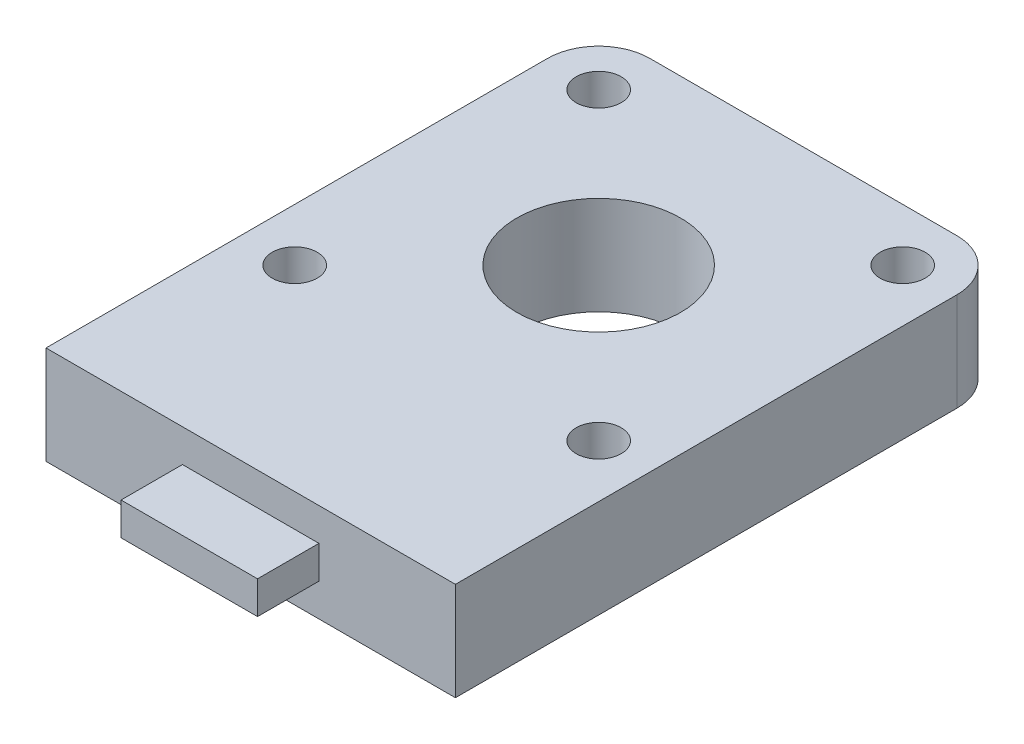
ISO-10303-21;
HEADER;
FILE_DESCRIPTION(('STEP AP214'),'2;1');
FILE_NAME('part.step','',(''),(''),'','','');
FILE_SCHEMA(('AUTOMOTIVE_DESIGN { 1 0 10303 214 1 1 1 1 }'));
ENDSEC;
DATA;
#1=APPLICATION_CONTEXT('core data for automotive mechanical design processes');
#2=APPLICATION_PROTOCOL_DEFINITION('international standard','automotive_design',2000,#1);
#3=PRODUCT_CONTEXT('',#1,'mechanical');
#4=PRODUCT('Part','Part','',(#3));
#5=PRODUCT_RELATED_PRODUCT_CATEGORY('part','',(#4));
#6=PRODUCT_DEFINITION_FORMATION('','',#4);
#7=PRODUCT_DEFINITION_CONTEXT('part definition',#1,'design');
#8=PRODUCT_DEFINITION('design','',#6,#7);
#9=PRODUCT_DEFINITION_SHAPE('','',#8);
#10=(LENGTH_UNIT() NAMED_UNIT(*) SI_UNIT(.MILLI.,.METRE.));
#11=(NAMED_UNIT(*) PLANE_ANGLE_UNIT() SI_UNIT($,.RADIAN.));
#12=(NAMED_UNIT(*) SI_UNIT($,.STERADIAN.) SOLID_ANGLE_UNIT());
#13=UNCERTAINTY_MEASURE_WITH_UNIT(LENGTH_MEASURE(1.E-05),#10,'distance_accuracy_value','');
#14=(GEOMETRIC_REPRESENTATION_CONTEXT(3) GLOBAL_UNCERTAINTY_ASSIGNED_CONTEXT((#13)) GLOBAL_UNIT_ASSIGNED_CONTEXT((#10,
#11,#12)) REPRESENTATION_CONTEXT('',''));
#15=CARTESIAN_POINT('',(0.,0.,0.));
#16=DIRECTION('',(0.,0.,1.));
#17=DIRECTION('',(1.,0.,0.));
#18=AXIS2_PLACEMENT_3D('',#15,#16,#17);
#19=CARTESIAN_POINT('',(-10.,4.8,17.));
#20=DIRECTION('',(0.,0.,-1.));
#21=DIRECTION('',(-1.,0.,0.));
#22=AXIS2_PLACEMENT_3D('',#19,#20,#21);
#23=PLANE('',#22);
#24=DIRECTION('',(1.,0.,0.));
#25=VECTOR('',#24,1.);
#26=CARTESIAN_POINT('',(-10.,0.,17.));
#27=LINE('',#26,#25);
#28=CARTESIAN_POINT('',(-10.,0.,17.));
#29=VERTEX_POINT('',#28);
#30=CARTESIAN_POINT('',(10.,0.,17.));
#31=VERTEX_POINT('',#30);
#32=EDGE_CURVE('E182',#29,#31,#27,.T.);
#33=ORIENTED_EDGE('',*,*,#32,.T.);
#34=DIRECTION('',(0.,-1.,0.));
#35=VECTOR('',#34,1.);
#36=CARTESIAN_POINT('',(10.,4.8,17.));
#37=LINE('',#36,#35);
#38=CARTESIAN_POINT('',(10.,4.8,17.));
#39=VERTEX_POINT('',#38);
#40=EDGE_CURVE('E180',#39,#31,#37,.T.);
#41=ORIENTED_EDGE('',*,*,#40,.F.);
#42=DIRECTION('',(1.,0.,0.));
#43=VECTOR('',#42,1.);
#44=CARTESIAN_POINT('',(-10.,4.8,17.));
#45=LINE('',#44,#43);
#46=CARTESIAN_POINT('',(-10.,4.8,17.));
#47=VERTEX_POINT('',#46);
#48=EDGE_CURVE('E172',#47,#39,#45,.T.);
#49=ORIENTED_EDGE('',*,*,#48,.F.);
#50=DIRECTION('',(0.,-1.,0.));
#51=VECTOR('',#50,1.);
#52=CARTESIAN_POINT('',(-10.,4.8,17.));
#53=LINE('',#52,#51);
#54=EDGE_CURVE('E190',#47,#29,#53,.T.);
#55=ORIENTED_EDGE('',*,*,#54,.T.);
#56=EDGE_LOOP('',(#33,#41,#49,#55));
#57=FACE_BOUND('',#56,.T.);
#58=DIRECTION('',(0.,-1.,0.));
#59=VECTOR('',#58,1.);
#60=CARTESIAN_POINT('',(-3.33333333333334,3.2,17.));
#61=LINE('',#60,#59);
#62=CARTESIAN_POINT('',(-3.33333333333334,3.2,17.));
#63=VERTEX_POINT('',#62);
#64=CARTESIAN_POINT('',(-3.33333333333334,1.6,17.));
#65=VERTEX_POINT('',#64);
#66=EDGE_CURVE('E53',#63,#65,#61,.T.);
#67=ORIENTED_EDGE('',*,*,#66,.F.);
#68=DIRECTION('',(-1.,0.,0.));
#69=VECTOR('',#68,1.);
#70=CARTESIAN_POINT('',(-3.33333333333334,3.2,17.));
#71=LINE('',#70,#69);
#72=CARTESIAN_POINT('',(3.33333333333333,3.2,17.));
#73=VERTEX_POINT('',#72);
#74=EDGE_CURVE('E57',#73,#63,#71,.T.);
#75=ORIENTED_EDGE('',*,*,#74,.F.);
#76=DIRECTION('',(0.,1.,0.));
#77=VECTOR('',#76,1.);
#78=CARTESIAN_POINT('',(3.33333333333333,3.2,17.));
#79=LINE('',#78,#77);
#80=CARTESIAN_POINT('',(3.33333333333333,1.6,17.));
#81=VERTEX_POINT('',#80);
#82=EDGE_CURVE('E367',#81,#73,#79,.T.);
#83=ORIENTED_EDGE('',*,*,#82,.F.);
#84=DIRECTION('',(1.,0.,0.));
#85=VECTOR('',#84,1.);
#86=CARTESIAN_POINT('',(-3.33333333333334,1.6,17.));
#87=LINE('',#86,#85);
#88=EDGE_CURVE('E373',#65,#81,#87,.T.);
#89=ORIENTED_EDGE('',*,*,#88,.F.);
#90=EDGE_LOOP('',(#67,#75,#83,#89));
#91=FACE_BOUND('',#90,.T.);
#92=ADVANCED_FACE('F38',(#57,#91),#23,.F.);
#93=CARTESIAN_POINT('',(0.,4.8,0.));
#94=DIRECTION('',(0.,-1.,0.));
#95=DIRECTION('',(0.,0.,-1.));
#96=AXIS2_PLACEMENT_3D('',#93,#94,#95);
#97=PLANE('',#96);
#98=DIRECTION('',(0.,0.,-1.));
#99=VECTOR('',#98,1.);
#100=CARTESIAN_POINT('',(10.,4.8,17.));
#101=LINE('',#100,#99);
#102=CARTESIAN_POINT('',(10.,4.8,-7.5));
#103=VERTEX_POINT('',#102);
#104=EDGE_CURVE('E175',#39,#103,#101,.T.);
#105=ORIENTED_EDGE('',*,*,#104,.T.);
#106=CARTESIAN_POINT('',(7.49999999999999,4.8,-7.5));
#107=DIRECTION('',(0.,-1.,0.));
#108=DIRECTION('',(0.,0.,-1.));
#109=AXIS2_PLACEMENT_3D('',#106,#107,#108);
#110=CIRCLE('',#109,2.5);
#111=CARTESIAN_POINT('',(7.49999999999999,4.8,-10.));
#112=VERTEX_POINT('',#111);
#113=EDGE_CURVE('E11',#103,#112,#110,.F.);
#114=ORIENTED_EDGE('',*,*,#113,.T.);
#115=DIRECTION('',(-1.,0.,0.));
#116=VECTOR('',#115,1.);
#117=CARTESIAN_POINT('',(-10.,4.8,-10.));
#118=LINE('',#117,#116);
#119=CARTESIAN_POINT('',(-7.50000000000001,4.8,-10.));
#120=VERTEX_POINT('',#119);
#121=EDGE_CURVE('E178',#112,#120,#118,.T.);
#122=ORIENTED_EDGE('',*,*,#121,.T.);
#123=CARTESIAN_POINT('',(-7.50000000000001,4.8,-7.5));
#124=DIRECTION('',(0.,-1.,0.));
#125=DIRECTION('',(0.,0.,-1.));
#126=AXIS2_PLACEMENT_3D('',#123,#124,#125);
#127=CIRCLE('',#126,2.5);
#128=CARTESIAN_POINT('',(-10.,4.8,-7.5));
#129=VERTEX_POINT('',#128);
#130=EDGE_CURVE('E202',#120,#129,#127,.F.);
#131=ORIENTED_EDGE('',*,*,#130,.T.);
#132=DIRECTION('',(0.,0.,1.));
#133=VECTOR('',#132,1.);
#134=CARTESIAN_POINT('',(-10.,4.8,17.));
#135=LINE('',#134,#133);
#136=EDGE_CURVE('E170',#129,#47,#135,.T.);
#137=ORIENTED_EDGE('',*,*,#136,.T.);
#138=ORIENTED_EDGE('',*,*,#48,.T.);
#139=EDGE_LOOP('',(#105,#114,#122,#131,#137,#138));
#140=FACE_BOUND('',#139,.T.);
#141=CARTESIAN_POINT('',(7.42462120245875,4.8,-7.42462120245875));
#142=DIRECTION('',(0.,1.,0.));
#143=DIRECTION('',(0.,0.,1.));
#144=AXIS2_PLACEMENT_3D('',#141,#142,#143);
#145=CIRCLE('',#144,1.1);
#146=CARTESIAN_POINT('',(7.42462120245875,4.8,-6.32462120245875));
#147=VERTEX_POINT('',#146);
#148=EDGE_CURVE('E164',#147,#147,#145,.T.);
#149=ORIENTED_EDGE('',*,*,#148,.F.);
#150=EDGE_LOOP('',(#149));
#151=FACE_BOUND('',#150,.T.);
#152=CARTESIAN_POINT('',(0.,4.8,0.));
#153=DIRECTION('',(0.,1.,0.));
#154=DIRECTION('',(0.,0.,1.));
#155=AXIS2_PLACEMENT_3D('',#152,#153,#154);
#156=CIRCLE('',#155,4.);
#157=CARTESIAN_POINT('',(0.,4.8,4.));
#158=VERTEX_POINT('',#157);
#159=EDGE_CURVE('E158',#158,#158,#156,.T.);
#160=ORIENTED_EDGE('',*,*,#159,.F.);
#161=EDGE_LOOP('',(#160));
#162=FACE_BOUND('',#161,.T.);
#163=CARTESIAN_POINT('',(7.42462120245916,4.8,7.42462120245875));
#164=DIRECTION('',(0.,1.,0.));
#165=DIRECTION('',(0.,0.,1.));
#166=AXIS2_PLACEMENT_3D('',#163,#164,#165);
#167=CIRCLE('',#166,1.0999999999999);
#168=CARTESIAN_POINT('',(7.42462120245916,4.8,8.52462120245865));
#169=VERTEX_POINT('',#168);
#170=EDGE_CURVE('E152',#169,#169,#167,.T.);
#171=ORIENTED_EDGE('',*,*,#170,.F.);
#172=EDGE_LOOP('',(#171));
#173=FACE_BOUND('',#172,.T.);
#174=CARTESIAN_POINT('',(-7.42462120245834,4.8,7.42462120245916));
#175=DIRECTION('',(0.,1.,0.));
#176=DIRECTION('',(0.,0.,1.));
#177=AXIS2_PLACEMENT_3D('',#174,#175,#176);
#178=CIRCLE('',#177,1.1000000000003);
#179=CARTESIAN_POINT('',(-7.42462120245834,4.8,8.52462120245947));
#180=VERTEX_POINT('',#179);
#181=EDGE_CURVE('E146',#180,#180,#178,.T.);
#182=ORIENTED_EDGE('',*,*,#181,.F.);
#183=EDGE_LOOP('',(#182));
#184=FACE_BOUND('',#183,.T.);
#185=CARTESIAN_POINT('',(-7.42462120245875,4.8,-7.42462120245834));
#186=DIRECTION('',(0.,1.,0.));
#187=DIRECTION('',(0.,0.,1.));
#188=AXIS2_PLACEMENT_3D('',#185,#186,#187);
#189=CIRCLE('',#188,1.10000000000045);
#190=CARTESIAN_POINT('',(-7.42462120245875,4.8,-6.32462120245789));
#191=VERTEX_POINT('',#190);
#192=EDGE_CURVE('E137',#191,#191,#189,.T.);
#193=ORIENTED_EDGE('',*,*,#192,.F.);
#194=EDGE_LOOP('',(#193));
#195=FACE_BOUND('',#194,.T.);
#196=ADVANCED_FACE('F216',(#140,#151,#162,#173,#184,#195),#97,.F.);
#197=CARTESIAN_POINT('',(0.,0.,0.));
#198=DIRECTION('',(0.,-1.,0.));
#199=DIRECTION('',(0.,0.,-1.));
#200=AXIS2_PLACEMENT_3D('',#197,#198,#199);
#201=PLANE('',#200);
#202=CARTESIAN_POINT('',(-7.42462120245834,0.,7.42462120245916));
#203=DIRECTION('',(0.,1.,0.));
#204=DIRECTION('',(0.,0.,1.));
#205=AXIS2_PLACEMENT_3D('',#202,#203,#204);
#206=CIRCLE('',#205,1.1000000000003);
#207=CARTESIAN_POINT('',(-7.42462120245834,0.,8.52462120245947));
#208=VERTEX_POINT('',#207);
#209=EDGE_CURVE('E144',#208,#208,#206,.T.);
#210=ORIENTED_EDGE('',*,*,#209,.T.);
#211=EDGE_LOOP('',(#210));
#212=FACE_BOUND('',#211,.T.);
#213=CARTESIAN_POINT('',(0.,0.,0.));
#214=DIRECTION('',(0.,1.,0.));
#215=DIRECTION('',(0.,0.,1.));
#216=AXIS2_PLACEMENT_3D('',#213,#214,#215);
#217=CIRCLE('',#216,4.);
#218=CARTESIAN_POINT('',(0.,0.,4.));
#219=VERTEX_POINT('',#218);
#220=EDGE_CURVE('E155',#219,#219,#217,.T.);
#221=ORIENTED_EDGE('',*,*,#220,.T.);
#222=EDGE_LOOP('',(#221));
#223=FACE_BOUND('',#222,.T.);
#224=DIRECTION('',(-1.,0.,0.));
#225=VECTOR('',#224,1.);
#226=CARTESIAN_POINT('',(-10.,0.,-10.));
#227=LINE('',#226,#225);
#228=CARTESIAN_POINT('',(7.49999999999999,0.,-10.));
#229=VERTEX_POINT('',#228);
#230=CARTESIAN_POINT('',(-7.50000000000001,0.,-10.));
#231=VERTEX_POINT('',#230);
#232=EDGE_CURVE('E173',#229,#231,#227,.T.);
#233=ORIENTED_EDGE('',*,*,#232,.F.);
#234=CARTESIAN_POINT('',(7.49999999999999,0.,-7.5));
#235=DIRECTION('',(0.,-1.,0.));
#236=DIRECTION('',(0.,0.,-1.));
#237=AXIS2_PLACEMENT_3D('',#234,#235,#236);
#238=CIRCLE('',#237,2.5);
#239=CARTESIAN_POINT('',(10.,0.,-7.5));
#240=VERTEX_POINT('',#239);
#241=EDGE_CURVE('E207',#229,#240,#238,.T.);
#242=ORIENTED_EDGE('',*,*,#241,.T.);
#243=DIRECTION('',(0.,0.,-1.));
#244=VECTOR('',#243,1.);
#245=CARTESIAN_POINT('',(10.,0.,17.));
#246=LINE('',#245,#244);
#247=EDGE_CURVE('E184',#31,#240,#246,.T.);
#248=ORIENTED_EDGE('',*,*,#247,.F.);
#249=ORIENTED_EDGE('',*,*,#32,.F.);
#250=DIRECTION('',(0.,0.,1.));
#251=VECTOR('',#250,1.);
#252=CARTESIAN_POINT('',(-10.,0.,17.));
#253=LINE('',#252,#251);
#254=CARTESIAN_POINT('',(-10.,0.,-7.5));
#255=VERTEX_POINT('',#254);
#256=EDGE_CURVE('E167',#255,#29,#253,.T.);
#257=ORIENTED_EDGE('',*,*,#256,.F.);
#258=CARTESIAN_POINT('',(-7.50000000000001,0.,-7.5));
#259=DIRECTION('',(0.,-1.,0.));
#260=DIRECTION('',(0.,0.,-1.));
#261=AXIS2_PLACEMENT_3D('',#258,#259,#260);
#262=CIRCLE('',#261,2.5);
#263=EDGE_CURVE('E196',#255,#231,#262,.T.);
#264=ORIENTED_EDGE('',*,*,#263,.T.);
#265=EDGE_LOOP('',(#233,#242,#248,#249,#257,#264));
#266=FACE_BOUND('',#265,.T.);
#267=CARTESIAN_POINT('',(7.42462120245875,0.,-7.42462120245875));
#268=DIRECTION('',(0.,1.,0.));
#269=DIRECTION('',(0.,0.,1.));
#270=AXIS2_PLACEMENT_3D('',#267,#268,#269);
#271=CIRCLE('',#270,1.1);
#272=CARTESIAN_POINT('',(7.42462120245875,0.,-6.32462120245875));
#273=VERTEX_POINT('',#272);
#274=EDGE_CURVE('E161',#273,#273,#271,.T.);
#275=ORIENTED_EDGE('',*,*,#274,.T.);
#276=EDGE_LOOP('',(#275));
#277=FACE_BOUND('',#276,.T.);
#278=CARTESIAN_POINT('',(7.42462120245916,0.,7.42462120245875));
#279=DIRECTION('',(0.,1.,0.));
#280=DIRECTION('',(0.,0.,1.));
#281=AXIS2_PLACEMENT_3D('',#278,#279,#280);
#282=CIRCLE('',#281,1.0999999999999);
#283=CARTESIAN_POINT('',(7.42462120245916,0.,8.52462120245865));
#284=VERTEX_POINT('',#283);
#285=EDGE_CURVE('E149',#284,#284,#282,.T.);
#286=ORIENTED_EDGE('',*,*,#285,.T.);
#287=EDGE_LOOP('',(#286));
#288=FACE_BOUND('',#287,.T.);
#289=CARTESIAN_POINT('',(-7.42462120245875,0.,-7.42462120245834));
#290=DIRECTION('',(0.,1.,0.));
#291=DIRECTION('',(0.,0.,1.));
#292=AXIS2_PLACEMENT_3D('',#289,#290,#291);
#293=CIRCLE('',#292,1.10000000000045);
#294=CARTESIAN_POINT('',(-7.42462120245875,0.,-6.32462120245789));
#295=VERTEX_POINT('',#294);
#296=EDGE_CURVE('E134',#295,#295,#293,.T.);
#297=ORIENTED_EDGE('',*,*,#296,.T.);
#298=EDGE_LOOP('',(#297));
#299=FACE_BOUND('',#298,.T.);
#300=ADVANCED_FACE('F226',(#212,#223,#266,#277,#288,#299),#201,.T.);
#301=CARTESIAN_POINT('',(-10.,4.8,17.));
#302=DIRECTION('',(1.,0.,0.));
#303=DIRECTION('',(0.,0.,-1.));
#304=AXIS2_PLACEMENT_3D('',#301,#302,#303);
#305=PLANE('',#304);
#306=ORIENTED_EDGE('',*,*,#136,.F.);
#307=DIRECTION('',(0.,-1.,0.));
#308=VECTOR('',#307,1.);
#309=CARTESIAN_POINT('',(-10.,4.8,-7.5));
#310=LINE('',#309,#308);
#311=EDGE_CURVE('E193',#129,#255,#310,.T.);
#312=ORIENTED_EDGE('',*,*,#311,.T.);
#313=ORIENTED_EDGE('',*,*,#256,.T.);
#314=ORIENTED_EDGE('',*,*,#54,.F.);
#315=EDGE_LOOP('',(#306,#312,#313,#314));
#316=FACE_BOUND('',#315,.T.);
#317=ADVANCED_FACE('F238',(#316),#305,.F.);
#318=CARTESIAN_POINT('',(10.,4.8,17.));
#319=DIRECTION('',(-1.,0.,0.));
#320=DIRECTION('',(0.,0.,1.));
#321=AXIS2_PLACEMENT_3D('',#318,#319,#320);
#322=PLANE('',#321);
#323=ORIENTED_EDGE('',*,*,#247,.T.);
#324=DIRECTION('',(0.,-1.,0.));
#325=VECTOR('',#324,1.);
#326=CARTESIAN_POINT('',(10.,4.8,-7.5));
#327=LINE('',#326,#325);
#328=EDGE_CURVE('E46',#240,#103,#327,.F.);
#329=ORIENTED_EDGE('',*,*,#328,.T.);
#330=ORIENTED_EDGE('',*,*,#104,.F.);
#331=ORIENTED_EDGE('',*,*,#40,.T.);
#332=EDGE_LOOP('',(#323,#329,#330,#331));
#333=FACE_BOUND('',#332,.T.);
#334=ADVANCED_FACE('F211',(#333),#322,.F.);
#335=CARTESIAN_POINT('',(-10.,4.8,-10.));
#336=DIRECTION('',(0.,0.,1.));
#337=DIRECTION('',(1.,0.,0.));
#338=AXIS2_PLACEMENT_3D('',#335,#336,#337);
#339=PLANE('',#338);
#340=ORIENTED_EDGE('',*,*,#121,.F.);
#341=DIRECTION('',(0.,-1.,0.));
#342=VECTOR('',#341,1.);
#343=CARTESIAN_POINT('',(7.49999999999999,4.8,-10.));
#344=LINE('',#343,#342);
#345=EDGE_CURVE('E204',#112,#229,#344,.T.);
#346=ORIENTED_EDGE('',*,*,#345,.T.);
#347=ORIENTED_EDGE('',*,*,#232,.T.);
#348=DIRECTION('',(0.,-1.,0.));
#349=VECTOR('',#348,1.);
#350=CARTESIAN_POINT('',(-7.50000000000001,4.8,-10.));
#351=LINE('',#350,#349);
#352=EDGE_CURVE('E199',#231,#120,#351,.F.);
#353=ORIENTED_EDGE('',*,*,#352,.T.);
#354=EDGE_LOOP('',(#340,#346,#347,#353));
#355=FACE_BOUND('',#354,.T.);
#356=ADVANCED_FACE('F224',(#355),#339,.F.);
#357=CARTESIAN_POINT('',(7.42462120245875,4.8,-7.42462120245875));
#358=DIRECTION('',(0.,-1.,0.));
#359=DIRECTION('',(0.,0.,-1.));
#360=AXIS2_PLACEMENT_3D('',#357,#358,#359);
#361=CYLINDRICAL_SURFACE('',#360,1.1);
#362=ORIENTED_EDGE('',*,*,#148,.T.);
#363=EDGE_LOOP('',(#362));
#364=FACE_BOUND('',#363,.T.);
#365=ORIENTED_EDGE('',*,*,#274,.F.);
#366=EDGE_LOOP('',(#365));
#367=FACE_BOUND('',#366,.T.);
#368=ADVANCED_FACE('F275',(#364,#367),#361,.F.);
#369=CARTESIAN_POINT('',(0.,4.8,0.));
#370=DIRECTION('',(0.,-1.,0.));
#371=DIRECTION('',(0.,0.,-1.));
#372=AXIS2_PLACEMENT_3D('',#369,#370,#371);
#373=CYLINDRICAL_SURFACE('',#372,4.);
#374=ORIENTED_EDGE('',*,*,#159,.T.);
#375=EDGE_LOOP('',(#374));
#376=FACE_BOUND('',#375,.T.);
#377=ORIENTED_EDGE('',*,*,#220,.F.);
#378=EDGE_LOOP('',(#377));
#379=FACE_BOUND('',#378,.T.);
#380=ADVANCED_FACE('F271',(#376,#379),#373,.F.);
#381=CARTESIAN_POINT('',(7.42462120245916,4.8,7.42462120245875));
#382=DIRECTION('',(0.,-1.,0.));
#383=DIRECTION('',(0.,0.,-1.));
#384=AXIS2_PLACEMENT_3D('',#381,#382,#383);
#385=CYLINDRICAL_SURFACE('',#384,1.0999999999999);
#386=ORIENTED_EDGE('',*,*,#170,.T.);
#387=EDGE_LOOP('',(#386));
#388=FACE_BOUND('',#387,.T.);
#389=ORIENTED_EDGE('',*,*,#285,.F.);
#390=EDGE_LOOP('',(#389));
#391=FACE_BOUND('',#390,.T.);
#392=ADVANCED_FACE('F262',(#388,#391),#385,.F.);
#393=CARTESIAN_POINT('',(-7.42462120245834,4.8,7.42462120245916));
#394=DIRECTION('',(0.,-1.,0.));
#395=DIRECTION('',(0.,0.,-1.));
#396=AXIS2_PLACEMENT_3D('',#393,#394,#395);
#397=CYLINDRICAL_SURFACE('',#396,1.1000000000003);
#398=ORIENTED_EDGE('',*,*,#181,.T.);
#399=EDGE_LOOP('',(#398));
#400=FACE_BOUND('',#399,.T.);
#401=ORIENTED_EDGE('',*,*,#209,.F.);
#402=EDGE_LOOP('',(#401));
#403=FACE_BOUND('',#402,.T.);
#404=ADVANCED_FACE('F256',(#400,#403),#397,.F.);
#405=CARTESIAN_POINT('',(-7.42462120245875,4.8,-7.42462120245834));
#406=DIRECTION('',(0.,-1.,0.));
#407=DIRECTION('',(0.,0.,-1.));
#408=AXIS2_PLACEMENT_3D('',#405,#406,#407);
#409=CYLINDRICAL_SURFACE('',#408,1.10000000000045);
#410=ORIENTED_EDGE('',*,*,#192,.T.);
#411=EDGE_LOOP('',(#410));
#412=FACE_BOUND('',#411,.T.);
#413=ORIENTED_EDGE('',*,*,#296,.F.);
#414=EDGE_LOOP('',(#413));
#415=FACE_BOUND('',#414,.T.);
#416=ADVANCED_FACE('F251',(#412,#415),#409,.F.);
#417=CARTESIAN_POINT('',(-7.50000000000001,4.8,-7.5));
#418=DIRECTION('',(0.,-1.,0.));
#419=DIRECTION('',(0.,0.,-1.));
#420=AXIS2_PLACEMENT_3D('',#417,#418,#419);
#421=CYLINDRICAL_SURFACE('',#420,2.5);
#422=ORIENTED_EDGE('',*,*,#130,.F.);
#423=ORIENTED_EDGE('',*,*,#352,.F.);
#424=ORIENTED_EDGE('',*,*,#263,.F.);
#425=ORIENTED_EDGE('',*,*,#311,.F.);
#426=EDGE_LOOP('',(#422,#423,#424,#425));
#427=FACE_BOUND('',#426,.T.);
#428=ADVANCED_FACE('F234',(#427),#421,.T.);
#429=CARTESIAN_POINT('',(7.49999999999999,4.8,-7.5));
#430=DIRECTION('',(0.,-1.,0.));
#431=DIRECTION('',(0.,0.,-1.));
#432=AXIS2_PLACEMENT_3D('',#429,#430,#431);
#433=CYLINDRICAL_SURFACE('',#432,2.5);
#434=ORIENTED_EDGE('',*,*,#113,.F.);
#435=ORIENTED_EDGE('',*,*,#328,.F.);
#436=ORIENTED_EDGE('',*,*,#241,.F.);
#437=ORIENTED_EDGE('',*,*,#345,.F.);
#438=EDGE_LOOP('',(#434,#435,#436,#437));
#439=FACE_BOUND('',#438,.T.);
#440=ADVANCED_FACE('F40',(#439),#433,.T.);
#441=CARTESIAN_POINT('',(-3.33333333333334,3.2,20.));
#442=DIRECTION('',(1.,0.,0.));
#443=DIRECTION('',(0.,0.,-1.));
#444=AXIS2_PLACEMENT_3D('',#441,#442,#443);
#445=PLANE('',#444);
#446=ORIENTED_EDGE('',*,*,#66,.T.);
#447=DIRECTION('',(0.,0.,-1.));
#448=VECTOR('',#447,1.);
#449=CARTESIAN_POINT('',(-3.33333333333334,1.6,20.));
#450=LINE('',#449,#448);
#451=CARTESIAN_POINT('',(-3.33333333333334,1.6,20.));
#452=VERTEX_POINT('',#451);
#453=EDGE_CURVE('E117',#452,#65,#450,.T.);
#454=ORIENTED_EDGE('',*,*,#453,.F.);
#455=DIRECTION('',(0.,-1.,0.));
#456=VECTOR('',#455,1.);
#457=CARTESIAN_POINT('',(-3.33333333333334,3.2,20.));
#458=LINE('',#457,#456);
#459=CARTESIAN_POINT('',(-3.33333333333334,3.2,20.));
#460=VERTEX_POINT('',#459);
#461=EDGE_CURVE('E123',#460,#452,#458,.T.);
#462=ORIENTED_EDGE('',*,*,#461,.F.);
#463=DIRECTION('',(0.,0.,-1.));
#464=VECTOR('',#463,1.);
#465=CARTESIAN_POINT('',(-3.33333333333334,3.2,20.));
#466=LINE('',#465,#464);
#467=EDGE_CURVE('E365',#460,#63,#466,.T.);
#468=ORIENTED_EDGE('',*,*,#467,.T.);
#469=EDGE_LOOP('',(#446,#454,#462,#468));
#470=FACE_BOUND('',#469,.T.);
#471=ADVANCED_FACE('F133',(#470),#445,.F.);
#472=CARTESIAN_POINT('',(-3.33333333333334,1.6,20.));
#473=DIRECTION('',(0.,1.,0.));
#474=DIRECTION('',(0.,0.,1.));
#475=AXIS2_PLACEMENT_3D('',#472,#473,#474);
#476=PLANE('',#475);
#477=ORIENTED_EDGE('',*,*,#88,.T.);
#478=DIRECTION('',(0.,0.,-1.));
#479=VECTOR('',#478,1.);
#480=CARTESIAN_POINT('',(3.33333333333333,1.6,20.));
#481=LINE('',#480,#479);
#482=CARTESIAN_POINT('',(3.33333333333333,1.6,20.));
#483=VERTEX_POINT('',#482);
#484=EDGE_CURVE('E119',#483,#81,#481,.T.);
#485=ORIENTED_EDGE('',*,*,#484,.F.);
#486=DIRECTION('',(1.,0.,0.));
#487=VECTOR('',#486,1.);
#488=CARTESIAN_POINT('',(-3.33333333333334,1.6,20.));
#489=LINE('',#488,#487);
#490=EDGE_CURVE('E112',#452,#483,#489,.T.);
#491=ORIENTED_EDGE('',*,*,#490,.F.);
#492=ORIENTED_EDGE('',*,*,#453,.T.);
#493=EDGE_LOOP('',(#477,#485,#491,#492));
#494=FACE_BOUND('',#493,.T.);
#495=ADVANCED_FACE('F115',(#494),#476,.F.);
#496=CARTESIAN_POINT('',(3.33333333333333,3.2,20.));
#497=DIRECTION('',(-1.,0.,0.));
#498=DIRECTION('',(0.,-1.,0.));
#499=AXIS2_PLACEMENT_3D('',#496,#497,#498);
#500=PLANE('',#499);
#501=ORIENTED_EDGE('',*,*,#82,.T.);
#502=DIRECTION('',(0.,0.,-1.));
#503=VECTOR('',#502,1.);
#504=CARTESIAN_POINT('',(3.33333333333333,3.2,20.));
#505=LINE('',#504,#503);
#506=CARTESIAN_POINT('',(3.33333333333333,3.2,20.));
#507=VERTEX_POINT('',#506);
#508=EDGE_CURVE('E139',#507,#73,#505,.T.);
#509=ORIENTED_EDGE('',*,*,#508,.F.);
#510=DIRECTION('',(0.,1.,0.));
#511=VECTOR('',#510,1.);
#512=CARTESIAN_POINT('',(3.33333333333333,3.2,20.));
#513=LINE('',#512,#511);
#514=EDGE_CURVE('E122',#483,#507,#513,.T.);
#515=ORIENTED_EDGE('',*,*,#514,.F.);
#516=ORIENTED_EDGE('',*,*,#484,.T.);
#517=EDGE_LOOP('',(#501,#509,#515,#516));
#518=FACE_BOUND('',#517,.T.);
#519=ADVANCED_FACE('F333',(#518),#500,.F.);
#520=CARTESIAN_POINT('',(-3.33333333333334,3.2,20.));
#521=DIRECTION('',(0.,-1.,0.));
#522=DIRECTION('',(0.,0.,-1.));
#523=AXIS2_PLACEMENT_3D('',#520,#521,#522);
#524=PLANE('',#523);
#525=ORIENTED_EDGE('',*,*,#74,.T.);
#526=ORIENTED_EDGE('',*,*,#467,.F.);
#527=DIRECTION('',(-1.,0.,0.));
#528=VECTOR('',#527,1.);
#529=CARTESIAN_POINT('',(-3.33333333333334,3.2,20.));
#530=LINE('',#529,#528);
#531=EDGE_CURVE('E128',#507,#460,#530,.T.);
#532=ORIENTED_EDGE('',*,*,#531,.F.);
#533=ORIENTED_EDGE('',*,*,#508,.T.);
#534=EDGE_LOOP('',(#525,#526,#532,#533));
#535=FACE_BOUND('',#534,.T.);
#536=ADVANCED_FACE('F340',(#535),#524,.F.);
#537=CARTESIAN_POINT('',(0.,0.,20.));
#538=DIRECTION('',(0.,0.,1.));
#539=DIRECTION('',(1.,0.,0.));
#540=AXIS2_PLACEMENT_3D('',#537,#538,#539);
#541=PLANE('',#540);
#542=ORIENTED_EDGE('',*,*,#461,.T.);
#543=ORIENTED_EDGE('',*,*,#490,.T.);
#544=ORIENTED_EDGE('',*,*,#514,.T.);
#545=ORIENTED_EDGE('',*,*,#531,.T.);
#546=EDGE_LOOP('',(#542,#543,#544,#545));
#547=FACE_BOUND('',#546,.T.);
#548=ADVANCED_FACE('F126',(#547),#541,.T.);
#549=CLOSED_SHELL('',(#92,#196,#300,#317,#334,#356,#368,#380,#392,#404,#416,#428,#440,#471,#495,
#519,#536,#548));
#550=MANIFOLD_SOLID_BREP('B2',#549);
#551=ADVANCED_BREP_SHAPE_REPRESENTATION('',(#18,#550),#14);
#552=SHAPE_DEFINITION_REPRESENTATION(#9,#551);
ENDSEC;
END-ISO-10303-21;
